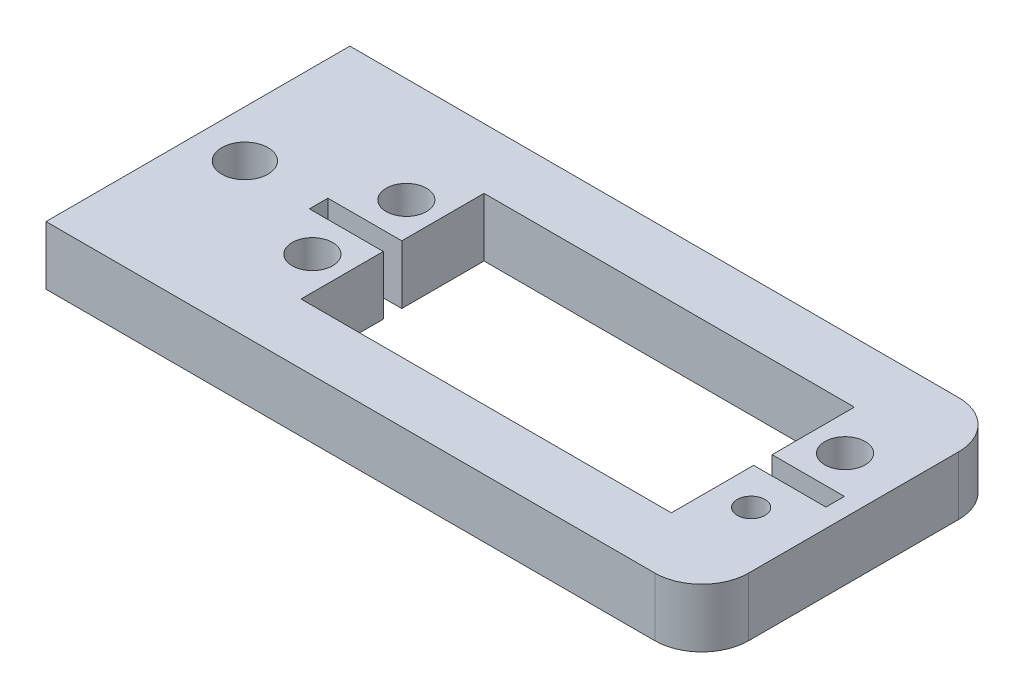
ISO-10303-21;
HEADER;
FILE_DESCRIPTION(('STEP AP214'),'2;1');
FILE_NAME('part.step','',(''),(''),'','','');
FILE_SCHEMA(('AUTOMOTIVE_DESIGN { 1 0 10303 214 1 1 1 1 }'));
ENDSEC;
DATA;
#1=APPLICATION_CONTEXT('core data for automotive mechanical design processes');
#2=APPLICATION_PROTOCOL_DEFINITION('international standard','automotive_design',2000,#1);
#3=PRODUCT_CONTEXT('',#1,'mechanical');
#4=PRODUCT('Part','Part','',(#3));
#5=PRODUCT_RELATED_PRODUCT_CATEGORY('part','',(#4));
#6=PRODUCT_DEFINITION_FORMATION('','',#4);
#7=PRODUCT_DEFINITION_CONTEXT('part definition',#1,'design');
#8=PRODUCT_DEFINITION('design','',#6,#7);
#9=PRODUCT_DEFINITION_SHAPE('','',#8);
#10=(LENGTH_UNIT() NAMED_UNIT(*) SI_UNIT(.MILLI.,.METRE.));
#11=(NAMED_UNIT(*) PLANE_ANGLE_UNIT() SI_UNIT($,.RADIAN.));
#12=(NAMED_UNIT(*) SI_UNIT($,.STERADIAN.) SOLID_ANGLE_UNIT());
#13=UNCERTAINTY_MEASURE_WITH_UNIT(LENGTH_MEASURE(1.E-05),#10,'distance_accuracy_value','');
#14=(GEOMETRIC_REPRESENTATION_CONTEXT(3) GLOBAL_UNCERTAINTY_ASSIGNED_CONTEXT((#13)) GLOBAL_UNIT_ASSIGNED_CONTEXT((#10,
#11,#12)) REPRESENTATION_CONTEXT('',''));
#15=CARTESIAN_POINT('',(0.,0.,0.));
#16=DIRECTION('',(0.,0.,1.));
#17=DIRECTION('',(1.,0.,0.));
#18=AXIS2_PLACEMENT_3D('',#15,#16,#17);
#19=CARTESIAN_POINT('',(-9.15301843580485,6.35,6.51192544293538));
#20=DIRECTION('',(0.,-1.,0.));
#21=DIRECTION('',(0.,0.,-1.));
#22=AXIS2_PLACEMENT_3D('',#19,#20,#21);
#23=PLANE('',#22);
#24=CARTESIAN_POINT('',(-10.0931709240917,6.35,12.7969254429202));
#25=DIRECTION('',(0.,1.,0.));
#26=DIRECTION('',(0.,0.,1.));
#27=AXIS2_PLACEMENT_3D('',#24,#25,#26);
#28=CIRCLE('',#27,2.19000000000024);
#29=CARTESIAN_POINT('',(-10.0931709240917,6.35,14.9869254429205));
#30=VERTEX_POINT('',#29);
#31=EDGE_CURVE('E340',#30,#30,#28,.T.);
#32=ORIENTED_EDGE('',*,*,#31,.F.);
#33=EDGE_LOOP('',(#32));
#34=FACE_BOUND('',#33,.T.);
#35=CARTESIAN_POINT('',(-69.9914430771704,6.35,17.8819254429201));
#36=DIRECTION('',(0.,1.,0.));
#37=DIRECTION('',(0.,0.,1.));
#38=AXIS2_PLACEMENT_3D('',#35,#36,#37);
#39=CIRCLE('',#38,2.50000000000016);
#40=CARTESIAN_POINT('',(-69.9914430771704,6.35,20.3819254429203));
#41=VERTEX_POINT('',#40);
#42=EDGE_CURVE('E352',#41,#41,#39,.T.);
#43=ORIENTED_EDGE('',*,*,#42,.F.);
#44=EDGE_LOOP('',(#43));
#45=FACE_BOUND('',#44,.T.);
#46=DIRECTION('',(0.,0.,-1.));
#47=VECTOR('',#46,1.);
#48=CARTESIAN_POINT('',(-6.0730184358051,6.35,16.8819254429171));
#49=LINE('',#48,#47);
#50=CARTESIAN_POINT('',(-6.0730184358051,6.35,18.8819254429171));
#51=VERTEX_POINT('',#50);
#52=CARTESIAN_POINT('',(-6.0730184358051,6.35,16.8819254429171));
#53=VERTEX_POINT('',#52);
#54=EDGE_CURVE('E158',#51,#53,#49,.T.);
#55=ORIENTED_EDGE('',*,*,#54,.F.);
#56=DIRECTION('',(1.,0.,0.));
#57=VECTOR('',#56,1.);
#58=CARTESIAN_POINT('',(-13.9031709240931,6.35,18.8819254429171));
#59=LINE('',#58,#57);
#60=CARTESIAN_POINT('',(-13.9031709240931,6.35,18.8819254429171));
#61=VERTEX_POINT('',#60);
#62=EDGE_CURVE('E201',#61,#51,#59,.T.);
#63=ORIENTED_EDGE('',*,*,#62,.F.);
#64=DIRECTION('',(0.,0.,-1.));
#65=VECTOR('',#64,1.);
#66=CARTESIAN_POINT('',(-13.9031709240931,6.35,18.8819254429171));
#67=LINE('',#66,#65);
#68=CARTESIAN_POINT('',(-13.9031709240931,6.35,27.7919254429201));
#69=VERTEX_POINT('',#68);
#70=EDGE_CURVE('E199',#69,#61,#67,.T.);
#71=ORIENTED_EDGE('',*,*,#70,.F.);
#72=DIRECTION('',(1.,0.,0.));
#73=VECTOR('',#72,1.);
#74=CARTESIAN_POINT('',(-13.9031709240931,6.35,27.7919254429201));
#75=LINE('',#74,#73);
#76=CARTESIAN_POINT('',(-54.0031709240929,6.35,27.7919254429201));
#77=VERTEX_POINT('',#76);
#78=EDGE_CURVE('E197',#77,#69,#75,.T.);
#79=ORIENTED_EDGE('',*,*,#78,.F.);
#80=DIRECTION('',(0.,0.,1.));
#81=VECTOR('',#80,1.);
#82=CARTESIAN_POINT('',(-54.0031709240929,6.35,27.7919254429201));
#83=LINE('',#82,#81);
#84=CARTESIAN_POINT('',(-54.0031709240929,6.35,18.8819254429171));
#85=VERTEX_POINT('',#84);
#86=EDGE_CURVE('E195',#85,#77,#83,.T.);
#87=ORIENTED_EDGE('',*,*,#86,.F.);
#88=DIRECTION('',(1.,0.,0.));
#89=VECTOR('',#88,1.);
#90=CARTESIAN_POINT('',(-62.0031709240925,6.35,18.8819254429171));
#91=LINE('',#90,#89);
#92=CARTESIAN_POINT('',(-62.0031709240925,6.35,18.8819254429171));
#93=VERTEX_POINT('',#92);
#94=EDGE_CURVE('E193',#93,#85,#91,.T.);
#95=ORIENTED_EDGE('',*,*,#94,.F.);
#96=DIRECTION('',(0.,0.,1.));
#97=VECTOR('',#96,1.);
#98=CARTESIAN_POINT('',(-62.0031709240925,6.35,16.8819254429171));
#99=LINE('',#98,#97);
#100=CARTESIAN_POINT('',(-62.0031709240925,6.35,16.8819254429171));
#101=VERTEX_POINT('',#100);
#102=EDGE_CURVE('E191',#101,#93,#99,.T.);
#103=ORIENTED_EDGE('',*,*,#102,.F.);
#104=DIRECTION('',(-1.,0.,0.));
#105=VECTOR('',#104,1.);
#106=CARTESIAN_POINT('',(-54.0031709240929,6.35,16.8819254429171));
#107=LINE('',#106,#105);
#108=CARTESIAN_POINT('',(-54.0031709240929,6.35,16.8819254429171));
#109=VERTEX_POINT('',#108);
#110=EDGE_CURVE('E189',#109,#101,#107,.T.);
#111=ORIENTED_EDGE('',*,*,#110,.F.);
#112=DIRECTION('',(0.,0.,1.));
#113=VECTOR('',#112,1.);
#114=CARTESIAN_POINT('',(-54.0031709240929,6.35,16.8819254429171));
#115=LINE('',#114,#113);
#116=CARTESIAN_POINT('',(-54.0031709240929,6.35,7.97192544291991));
#117=VERTEX_POINT('',#116);
#118=EDGE_CURVE('E187',#117,#109,#115,.T.);
#119=ORIENTED_EDGE('',*,*,#118,.F.);
#120=DIRECTION('',(-1.,0.,0.));
#121=VECTOR('',#120,1.);
#122=CARTESIAN_POINT('',(-54.0031709240929,6.35,7.97192544291991));
#123=LINE('',#122,#121);
#124=CARTESIAN_POINT('',(-13.9031709240931,6.35,7.97192544291991));
#125=VERTEX_POINT('',#124);
#126=EDGE_CURVE('E182',#125,#117,#123,.T.);
#127=ORIENTED_EDGE('',*,*,#126,.F.);
#128=DIRECTION('',(0.,0.,-1.));
#129=VECTOR('',#128,1.);
#130=CARTESIAN_POINT('',(-13.9031709240931,6.35,7.97192544291991));
#131=LINE('',#130,#129);
#132=CARTESIAN_POINT('',(-13.9031709240931,6.35,16.8819254429171));
#133=VERTEX_POINT('',#132);
#134=EDGE_CURVE('E180',#133,#125,#131,.T.);
#135=ORIENTED_EDGE('',*,*,#134,.F.);
#136=DIRECTION('',(-1.,0.,0.));
#137=VECTOR('',#136,1.);
#138=CARTESIAN_POINT('',(-13.9031709240931,6.35,16.8819254429171));
#139=LINE('',#138,#137);
#140=EDGE_CURVE('E166',#53,#133,#139,.T.);
#141=ORIENTED_EDGE('',*,*,#140,.F.);
#142=EDGE_LOOP('',(#55,#63,#71,#79,#87,#95,#103,#111,#119,#127,#135,#141));
#143=FACE_BOUND('',#142,.T.);
#144=DIRECTION('',(-1.,0.,0.));
#145=VECTOR('',#144,1.);
#146=CARTESIAN_POINT('',(-75.0730184358046,6.35,1.43192544293586));
#147=LINE('',#146,#145);
#148=CARTESIAN_POINT('',(-9.15301843580485,6.35,1.43192544293586));
#149=VERTEX_POINT('',#148);
#150=CARTESIAN_POINT('',(-75.0730184358046,6.35,1.43192544293586));
#151=VERTEX_POINT('',#150);
#152=EDGE_CURVE('E254',#149,#151,#147,.T.);
#153=ORIENTED_EDGE('',*,*,#152,.T.);
#154=DIRECTION('',(0.,0.,1.));
#155=VECTOR('',#154,1.);
#156=CARTESIAN_POINT('',(-75.0730184358046,6.35,6.51192544291973));
#157=LINE('',#156,#155);
#158=CARTESIAN_POINT('',(-75.0730184358046,6.35,34.3319254429354));
#159=VERTEX_POINT('',#158);
#160=EDGE_CURVE('E257',#151,#159,#157,.T.);
#161=ORIENTED_EDGE('',*,*,#160,.T.);
#162=DIRECTION('',(1.,0.,0.));
#163=VECTOR('',#162,1.);
#164=CARTESIAN_POINT('',(-75.0730184358046,6.35,34.3319254429354));
#165=LINE('',#164,#163);
#166=CARTESIAN_POINT('',(-9.15301843580485,6.35,34.3319254429353));
#167=VERTEX_POINT('',#166);
#168=EDGE_CURVE('E260',#159,#167,#165,.T.);
#169=ORIENTED_EDGE('',*,*,#168,.T.);
#170=CARTESIAN_POINT('',(-9.15301843580485,6.35,29.2519254429358));
#171=DIRECTION('',(0.,1.,0.));
#172=DIRECTION('',(0.,0.,-1.));
#173=AXIS2_PLACEMENT_3D('',#170,#171,#172);
#174=CIRCLE('',#173,5.07999999999953);
#175=CARTESIAN_POINT('',(-4.07301843580532,6.35,29.2519254429244));
#176=VERTEX_POINT('',#175);
#177=EDGE_CURVE('E262',#167,#176,#174,.T.);
#178=ORIENTED_EDGE('',*,*,#177,.T.);
#179=DIRECTION('',(0.,0.,-1.));
#180=VECTOR('',#179,1.);
#181=CARTESIAN_POINT('',(-4.07301843580532,6.35,6.51192544291973));
#182=LINE('',#181,#180);
#183=CARTESIAN_POINT('',(-4.07301843580532,6.35,6.51192544291973));
#184=VERTEX_POINT('',#183);
#185=EDGE_CURVE('E264',#176,#184,#182,.T.);
#186=ORIENTED_EDGE('',*,*,#185,.T.);
#187=CARTESIAN_POINT('',(-9.15301843580485,6.35,6.51192544293538));
#188=DIRECTION('',(0.,1.,0.));
#189=DIRECTION('',(0.,0.,-1.));
#190=AXIS2_PLACEMENT_3D('',#187,#188,#189);
#191=CIRCLE('',#190,5.07999999999953);
#192=EDGE_CURVE('E266',#184,#149,#191,.T.);
#193=ORIENTED_EDGE('',*,*,#192,.T.);
#194=EDGE_LOOP('',(#153,#161,#169,#178,#186,#193));
#195=FACE_BOUND('',#194,.T.);
#196=CARTESIAN_POINT('',(-57.5931709240942,6.35,22.9669254429198));
#197=DIRECTION('',(0.,1.,0.));
#198=DIRECTION('',(0.,0.,1.));
#199=AXIS2_PLACEMENT_3D('',#196,#197,#198);
#200=CIRCLE('',#199,2.19000000000027);
#201=CARTESIAN_POINT('',(-57.5931709240942,6.35,25.1569254429201));
#202=VERTEX_POINT('',#201);
#203=EDGE_CURVE('E204',#202,#202,#200,.T.);
#204=ORIENTED_EDGE('',*,*,#203,.F.);
#205=EDGE_LOOP('',(#204));
#206=FACE_BOUND('',#205,.T.);
#207=CARTESIAN_POINT('',(-57.5931709240942,6.35,12.7969254429202));
#208=DIRECTION('',(0.,1.,0.));
#209=DIRECTION('',(0.,0.,-1.));
#210=AXIS2_PLACEMENT_3D('',#207,#208,#209);
#211=CIRCLE('',#210,2.19000000000027);
#212=CARTESIAN_POINT('',(-57.5931709240942,6.35,10.6069254429199));
#213=VERTEX_POINT('',#212);
#214=EDGE_CURVE('E331',#213,#213,#211,.T.);
#215=ORIENTED_EDGE('',*,*,#214,.F.);
#216=EDGE_LOOP('',(#215));
#217=FACE_BOUND('',#216,.T.);
#218=CARTESIAN_POINT('',(-10.0931709240917,6.35,22.9669254429198));
#219=DIRECTION('',(0.,1.,0.));
#220=DIRECTION('',(0.,0.,-1.));
#221=AXIS2_PLACEMENT_3D('',#218,#219,#220);
#222=CIRCLE('',#221,1.50000000000008);
#223=CARTESIAN_POINT('',(-10.0931709240917,6.35,21.4669254429197));
#224=VERTEX_POINT('',#223);
#225=EDGE_CURVE('E334',#224,#224,#222,.T.);
#226=ORIENTED_EDGE('',*,*,#225,.F.);
#227=EDGE_LOOP('',(#226));
#228=FACE_BOUND('',#227,.T.);
#229=ADVANCED_FACE('F33',(#34,#45,#143,#195,#206,#217,#228),#23,.F.);
#230=CARTESIAN_POINT('',(-9.15301843580485,0.,6.51192544293538));
#231=DIRECTION('',(0.,-1.,0.));
#232=DIRECTION('',(0.,0.,-1.));
#233=AXIS2_PLACEMENT_3D('',#230,#231,#232);
#234=PLANE('',#233);
#235=CARTESIAN_POINT('',(-10.0931709240917,0.,12.7969254429202));
#236=DIRECTION('',(0.,1.,0.));
#237=DIRECTION('',(0.,0.,1.));
#238=AXIS2_PLACEMENT_3D('',#235,#236,#237);
#239=CIRCLE('',#238,2.19000000000024);
#240=CARTESIAN_POINT('',(-10.0931709240917,0.,14.9869254429205));
#241=VERTEX_POINT('',#240);
#242=EDGE_CURVE('E336',#241,#241,#239,.T.);
#243=ORIENTED_EDGE('',*,*,#242,.T.);
#244=EDGE_LOOP('',(#243));
#245=FACE_BOUND('',#244,.T.);
#246=CARTESIAN_POINT('',(-69.9914430771704,0.,17.8819254429201));
#247=DIRECTION('',(0.,1.,0.));
#248=DIRECTION('',(0.,0.,1.));
#249=AXIS2_PLACEMENT_3D('',#246,#247,#248);
#250=CIRCLE('',#249,2.50000000000016);
#251=CARTESIAN_POINT('',(-69.9914430771704,0.,20.3819254429203));
#252=VERTEX_POINT('',#251);
#253=EDGE_CURVE('E349',#252,#252,#250,.T.);
#254=ORIENTED_EDGE('',*,*,#253,.T.);
#255=EDGE_LOOP('',(#254));
#256=FACE_BOUND('',#255,.T.);
#257=DIRECTION('',(1.,0.,0.));
#258=VECTOR('',#257,1.);
#259=CARTESIAN_POINT('',(-13.9031709240931,0.,18.8819254429171));
#260=LINE('',#259,#258);
#261=CARTESIAN_POINT('',(-13.9031709240931,0.,18.8819254429171));
#262=VERTEX_POINT('',#261);
#263=CARTESIAN_POINT('',(-6.0730184358051,0.,18.8819254429171));
#264=VERTEX_POINT('',#263);
#265=EDGE_CURVE('E167',#262,#264,#260,.T.);
#266=ORIENTED_EDGE('',*,*,#265,.T.);
#267=DIRECTION('',(0.,0.,-1.));
#268=VECTOR('',#267,1.);
#269=CARTESIAN_POINT('',(-6.0730184358051,0.,16.8819254429171));
#270=LINE('',#269,#268);
#271=CARTESIAN_POINT('',(-6.0730184358051,0.,16.8819254429171));
#272=VERTEX_POINT('',#271);
#273=EDGE_CURVE('E56',#264,#272,#270,.T.);
#274=ORIENTED_EDGE('',*,*,#273,.T.);
#275=DIRECTION('',(-1.,0.,0.));
#276=VECTOR('',#275,1.);
#277=CARTESIAN_POINT('',(-13.9031709240931,0.,16.8819254429171));
#278=LINE('',#277,#276);
#279=CARTESIAN_POINT('',(-13.9031709240931,0.,16.8819254429171));
#280=VERTEX_POINT('',#279);
#281=EDGE_CURVE('E173',#272,#280,#278,.T.);
#282=ORIENTED_EDGE('',*,*,#281,.T.);
#283=DIRECTION('',(0.,0.,-1.));
#284=VECTOR('',#283,1.);
#285=CARTESIAN_POINT('',(-13.9031709240931,0.,7.97192544291991));
#286=LINE('',#285,#284);
#287=CARTESIAN_POINT('',(-13.9031709240931,0.,7.97192544291991));
#288=VERTEX_POINT('',#287);
#289=EDGE_CURVE('E206',#280,#288,#286,.T.);
#290=ORIENTED_EDGE('',*,*,#289,.T.);
#291=DIRECTION('',(-1.,0.,0.));
#292=VECTOR('',#291,1.);
#293=CARTESIAN_POINT('',(-54.0031709240929,0.,7.97192544291991));
#294=LINE('',#293,#292);
#295=CARTESIAN_POINT('',(-54.0031709240929,0.,7.97192544291991));
#296=VERTEX_POINT('',#295);
#297=EDGE_CURVE('E209',#288,#296,#294,.T.);
#298=ORIENTED_EDGE('',*,*,#297,.T.);
#299=DIRECTION('',(0.,0.,1.));
#300=VECTOR('',#299,1.);
#301=CARTESIAN_POINT('',(-54.0031709240929,0.,16.8819254429171));
#302=LINE('',#301,#300);
#303=CARTESIAN_POINT('',(-54.0031709240929,0.,16.8819254429171));
#304=VERTEX_POINT('',#303);
#305=EDGE_CURVE('E212',#296,#304,#302,.T.);
#306=ORIENTED_EDGE('',*,*,#305,.T.);
#307=DIRECTION('',(-1.,0.,0.));
#308=VECTOR('',#307,1.);
#309=CARTESIAN_POINT('',(-54.0031709240929,0.,16.8819254429171));
#310=LINE('',#309,#308);
#311=CARTESIAN_POINT('',(-62.0031709240925,0.,16.8819254429171));
#312=VERTEX_POINT('',#311);
#313=EDGE_CURVE('E215',#304,#312,#310,.T.);
#314=ORIENTED_EDGE('',*,*,#313,.T.);
#315=DIRECTION('',(0.,0.,1.));
#316=VECTOR('',#315,1.);
#317=CARTESIAN_POINT('',(-62.0031709240925,0.,16.8819254429171));
#318=LINE('',#317,#316);
#319=CARTESIAN_POINT('',(-62.0031709240925,0.,18.8819254429171));
#320=VERTEX_POINT('',#319);
#321=EDGE_CURVE('E218',#312,#320,#318,.T.);
#322=ORIENTED_EDGE('',*,*,#321,.T.);
#323=DIRECTION('',(1.,0.,0.));
#324=VECTOR('',#323,1.);
#325=CARTESIAN_POINT('',(-62.0031709240925,0.,18.8819254429171));
#326=LINE('',#325,#324);
#327=CARTESIAN_POINT('',(-54.0031709240929,0.,18.8819254429171));
#328=VERTEX_POINT('',#327);
#329=EDGE_CURVE('E221',#320,#328,#326,.T.);
#330=ORIENTED_EDGE('',*,*,#329,.T.);
#331=DIRECTION('',(0.,0.,1.));
#332=VECTOR('',#331,1.);
#333=CARTESIAN_POINT('',(-54.0031709240929,0.,27.7919254429201));
#334=LINE('',#333,#332);
#335=CARTESIAN_POINT('',(-54.0031709240929,0.,27.7919254429201));
#336=VERTEX_POINT('',#335);
#337=EDGE_CURVE('E224',#328,#336,#334,.T.);
#338=ORIENTED_EDGE('',*,*,#337,.T.);
#339=DIRECTION('',(1.,0.,0.));
#340=VECTOR('',#339,1.);
#341=CARTESIAN_POINT('',(-13.9031709240931,0.,27.7919254429201));
#342=LINE('',#341,#340);
#343=CARTESIAN_POINT('',(-13.9031709240931,0.,27.7919254429201));
#344=VERTEX_POINT('',#343);
#345=EDGE_CURVE('E227',#336,#344,#342,.T.);
#346=ORIENTED_EDGE('',*,*,#345,.T.);
#347=DIRECTION('',(0.,0.,-1.));
#348=VECTOR('',#347,1.);
#349=CARTESIAN_POINT('',(-13.9031709240931,0.,18.8819254429171));
#350=LINE('',#349,#348);
#351=EDGE_CURVE('E230',#344,#262,#350,.T.);
#352=ORIENTED_EDGE('',*,*,#351,.T.);
#353=EDGE_LOOP('',(#266,#274,#282,#290,#298,#306,#314,#322,#330,#338,#346,#352));
#354=FACE_BOUND('',#353,.T.);
#355=DIRECTION('',(0.,0.,1.));
#356=VECTOR('',#355,1.);
#357=CARTESIAN_POINT('',(-75.0730184358046,0.,29.2519254429244));
#358=LINE('',#357,#356);
#359=CARTESIAN_POINT('',(-75.0730184358046,0.,1.43192544293586));
#360=VERTEX_POINT('',#359);
#361=CARTESIAN_POINT('',(-75.0730184358046,0.,34.3319254429354));
#362=VERTEX_POINT('',#361);
#363=EDGE_CURVE('E174',#360,#362,#358,.T.);
#364=ORIENTED_EDGE('',*,*,#363,.F.);
#365=DIRECTION('',(-1.,0.,0.));
#366=VECTOR('',#365,1.);
#367=CARTESIAN_POINT('',(-9.15301843580485,0.,1.43192544293586));
#368=LINE('',#367,#366);
#369=CARTESIAN_POINT('',(-9.15301843580485,0.,1.43192544293586));
#370=VERTEX_POINT('',#369);
#371=EDGE_CURVE('E258',#370,#360,#368,.T.);
#372=ORIENTED_EDGE('',*,*,#371,.F.);
#373=CARTESIAN_POINT('',(-9.15301843580485,0.,6.51192544293538));
#374=DIRECTION('',(0.,1.,0.));
#375=DIRECTION('',(0.,0.,-1.));
#376=AXIS2_PLACEMENT_3D('',#373,#374,#375);
#377=CIRCLE('',#376,5.07999999999953);
#378=CARTESIAN_POINT('',(-4.07301843580532,0.,6.51192544291973));
#379=VERTEX_POINT('',#378);
#380=EDGE_CURVE('E278',#379,#370,#377,.T.);
#381=ORIENTED_EDGE('',*,*,#380,.F.);
#382=DIRECTION('',(0.,0.,-1.));
#383=VECTOR('',#382,1.);
#384=CARTESIAN_POINT('',(-4.07301843580532,0.,6.51192544291973));
#385=LINE('',#384,#383);
#386=CARTESIAN_POINT('',(-4.07301843580532,0.,29.2519254429244));
#387=VERTEX_POINT('',#386);
#388=EDGE_CURVE('E276',#387,#379,#385,.T.);
#389=ORIENTED_EDGE('',*,*,#388,.F.);
#390=CARTESIAN_POINT('',(-9.15301843580485,0.,29.2519254429358));
#391=DIRECTION('',(0.,1.,0.));
#392=DIRECTION('',(0.,0.,-1.));
#393=AXIS2_PLACEMENT_3D('',#390,#391,#392);
#394=CIRCLE('',#393,5.07999999999953);
#395=CARTESIAN_POINT('',(-9.15301843580485,0.,34.3319254429353));
#396=VERTEX_POINT('',#395);
#397=EDGE_CURVE('E274',#396,#387,#394,.T.);
#398=ORIENTED_EDGE('',*,*,#397,.F.);
#399=DIRECTION('',(1.,0.,0.));
#400=VECTOR('',#399,1.);
#401=CARTESIAN_POINT('',(-9.15301843580485,0.,34.3319254429353));
#402=LINE('',#401,#400);
#403=EDGE_CURVE('E272',#362,#396,#402,.T.);
#404=ORIENTED_EDGE('',*,*,#403,.F.);
#405=EDGE_LOOP('',(#364,#372,#381,#389,#398,#404));
#406=FACE_BOUND('',#405,.T.);
#407=CARTESIAN_POINT('',(-57.5931709240942,0.,22.9669254429198));
#408=DIRECTION('',(0.,1.,0.));
#409=DIRECTION('',(0.,0.,1.));
#410=AXIS2_PLACEMENT_3D('',#407,#408,#409);
#411=CIRCLE('',#410,2.19000000000027);
#412=CARTESIAN_POINT('',(-57.5931709240942,0.,25.1569254429201));
#413=VERTEX_POINT('',#412);
#414=EDGE_CURVE('E355',#413,#413,#411,.T.);
#415=ORIENTED_EDGE('',*,*,#414,.T.);
#416=EDGE_LOOP('',(#415));
#417=FACE_BOUND('',#416,.T.);
#418=CARTESIAN_POINT('',(-57.5931709240942,0.,12.7969254429202));
#419=DIRECTION('',(0.,1.,0.));
#420=DIRECTION('',(0.,0.,-1.));
#421=AXIS2_PLACEMENT_3D('',#418,#419,#420);
#422=CIRCLE('',#421,2.19000000000027);
#423=CARTESIAN_POINT('',(-57.5931709240942,0.,10.6069254429199));
#424=VERTEX_POINT('',#423);
#425=EDGE_CURVE('E346',#424,#424,#422,.T.);
#426=ORIENTED_EDGE('',*,*,#425,.T.);
#427=EDGE_LOOP('',(#426));
#428=FACE_BOUND('',#427,.T.);
#429=CARTESIAN_POINT('',(-10.0931709240917,0.,22.9669254429198));
#430=DIRECTION('',(0.,1.,0.));
#431=DIRECTION('',(0.,0.,-1.));
#432=AXIS2_PLACEMENT_3D('',#429,#430,#431);
#433=CIRCLE('',#432,1.50000000000008);
#434=CARTESIAN_POINT('',(-10.0931709240917,0.,21.4669254429197));
#435=VERTEX_POINT('',#434);
#436=EDGE_CURVE('E337',#435,#435,#433,.T.);
#437=ORIENTED_EDGE('',*,*,#436,.T.);
#438=EDGE_LOOP('',(#437));
#439=FACE_BOUND('',#438,.T.);
#440=ADVANCED_FACE('F302',(#245,#256,#354,#406,#417,#428,#439),#234,.T.);
#441=CARTESIAN_POINT('',(-75.0730184358046,6.35,29.2519254429244));
#442=DIRECTION('',(1.,0.,0.));
#443=DIRECTION('',(0.,0.,-1.));
#444=AXIS2_PLACEMENT_3D('',#441,#442,#443);
#445=PLANE('',#444);
#446=ORIENTED_EDGE('',*,*,#363,.T.);
#447=DIRECTION('',(0.,-1.,0.));
#448=VECTOR('',#447,1.);
#449=CARTESIAN_POINT('',(-75.0730184358046,6.35,34.3319254429354));
#450=LINE('',#449,#448);
#451=EDGE_CURVE('E41',#159,#362,#450,.T.);
#452=ORIENTED_EDGE('',*,*,#451,.F.);
#453=ORIENTED_EDGE('',*,*,#160,.F.);
#454=DIRECTION('',(0.,-1.,0.));
#455=VECTOR('',#454,1.);
#456=CARTESIAN_POINT('',(-75.0730184358046,6.35,1.43192544293586));
#457=LINE('',#456,#455);
#458=EDGE_CURVE('E11',#151,#360,#457,.T.);
#459=ORIENTED_EDGE('',*,*,#458,.T.);
#460=EDGE_LOOP('',(#446,#452,#453,#459));
#461=FACE_BOUND('',#460,.T.);
#462=ADVANCED_FACE('F35',(#461),#445,.F.);
#463=CARTESIAN_POINT('',(-9.15301843580485,6.35,34.3319254429353));
#464=DIRECTION('',(0.,0.,-1.));
#465=DIRECTION('',(-1.,0.,0.));
#466=AXIS2_PLACEMENT_3D('',#463,#464,#465);
#467=PLANE('',#466);
#468=ORIENTED_EDGE('',*,*,#403,.T.);
#469=DIRECTION('',(0.,-1.,0.));
#470=VECTOR('',#469,1.);
#471=CARTESIAN_POINT('',(-9.15301843580485,6.35,34.3319254429353));
#472=LINE('',#471,#470);
#473=EDGE_CURVE('E290',#167,#396,#472,.T.);
#474=ORIENTED_EDGE('',*,*,#473,.F.);
#475=ORIENTED_EDGE('',*,*,#168,.F.);
#476=ORIENTED_EDGE('',*,*,#451,.T.);
#477=EDGE_LOOP('',(#468,#474,#475,#476));
#478=FACE_BOUND('',#477,.T.);
#479=ADVANCED_FACE('F296',(#478),#467,.F.);
#480=CARTESIAN_POINT('',(-9.15301843580485,6.35,29.2519254429358));
#481=DIRECTION('',(0.,-1.,0.));
#482=DIRECTION('',(0.,0.,-1.));
#483=AXIS2_PLACEMENT_3D('',#480,#481,#482);
#484=CYLINDRICAL_SURFACE('',#483,5.07999999999953);
#485=ORIENTED_EDGE('',*,*,#397,.T.);
#486=DIRECTION('',(0.,-1.,0.));
#487=VECTOR('',#486,1.);
#488=CARTESIAN_POINT('',(-4.07301843580532,6.35,29.2519254429244));
#489=LINE('',#488,#487);
#490=EDGE_CURVE('E287',#176,#387,#489,.T.);
#491=ORIENTED_EDGE('',*,*,#490,.F.);
#492=ORIENTED_EDGE('',*,*,#177,.F.);
#493=ORIENTED_EDGE('',*,*,#473,.T.);
#494=EDGE_LOOP('',(#485,#491,#492,#493));
#495=FACE_BOUND('',#494,.T.);
#496=ADVANCED_FACE('F320',(#495),#484,.T.);
#497=CARTESIAN_POINT('',(-4.07301843580532,6.35,6.51192544291973));
#498=DIRECTION('',(-1.,0.,0.));
#499=DIRECTION('',(0.,0.,1.));
#500=AXIS2_PLACEMENT_3D('',#497,#498,#499);
#501=PLANE('',#500);
#502=ORIENTED_EDGE('',*,*,#388,.T.);
#503=DIRECTION('',(0.,-1.,0.));
#504=VECTOR('',#503,1.);
#505=CARTESIAN_POINT('',(-4.07301843580532,6.35,6.51192544291973));
#506=LINE('',#505,#504);
#507=EDGE_CURVE('E284',#184,#379,#506,.T.);
#508=ORIENTED_EDGE('',*,*,#507,.F.);
#509=ORIENTED_EDGE('',*,*,#185,.F.);
#510=ORIENTED_EDGE('',*,*,#490,.T.);
#511=EDGE_LOOP('',(#502,#508,#509,#510));
#512=FACE_BOUND('',#511,.T.);
#513=ADVANCED_FACE('F315',(#512),#501,.F.);
#514=CARTESIAN_POINT('',(-9.15301843580485,6.35,6.51192544293538));
#515=DIRECTION('',(0.,-1.,0.));
#516=DIRECTION('',(0.,0.,-1.));
#517=AXIS2_PLACEMENT_3D('',#514,#515,#516);
#518=CYLINDRICAL_SURFACE('',#517,5.07999999999953);
#519=ORIENTED_EDGE('',*,*,#380,.T.);
#520=DIRECTION('',(0.,-1.,0.));
#521=VECTOR('',#520,1.);
#522=CARTESIAN_POINT('',(-9.15301843580485,6.35,1.43192544293586));
#523=LINE('',#522,#521);
#524=EDGE_CURVE('E269',#149,#370,#523,.T.);
#525=ORIENTED_EDGE('',*,*,#524,.F.);
#526=ORIENTED_EDGE('',*,*,#192,.F.);
#527=ORIENTED_EDGE('',*,*,#507,.T.);
#528=EDGE_LOOP('',(#519,#525,#526,#527));
#529=FACE_BOUND('',#528,.T.);
#530=ADVANCED_FACE('F311',(#529),#518,.T.);
#531=CARTESIAN_POINT('',(-9.15301843580485,6.35,1.43192544293586));
#532=DIRECTION('',(0.,0.,1.));
#533=DIRECTION('',(1.,0.,0.));
#534=AXIS2_PLACEMENT_3D('',#531,#532,#533);
#535=PLANE('',#534);
#536=ORIENTED_EDGE('',*,*,#371,.T.);
#537=ORIENTED_EDGE('',*,*,#458,.F.);
#538=ORIENTED_EDGE('',*,*,#152,.F.);
#539=ORIENTED_EDGE('',*,*,#524,.T.);
#540=EDGE_LOOP('',(#536,#537,#538,#539));
#541=FACE_BOUND('',#540,.T.);
#542=ADVANCED_FACE('F307',(#541),#535,.F.);
#543=CARTESIAN_POINT('',(-6.0730184358051,6.35,16.8819254429171));
#544=DIRECTION('',(-1.,0.,0.));
#545=DIRECTION('',(0.,0.,1.));
#546=AXIS2_PLACEMENT_3D('',#543,#544,#545);
#547=PLANE('',#546);
#548=ORIENTED_EDGE('',*,*,#273,.F.);
#549=DIRECTION('',(0.,-1.,0.));
#550=VECTOR('',#549,1.);
#551=CARTESIAN_POINT('',(-6.0730184358051,6.35,18.8819254429171));
#552=LINE('',#551,#550);
#553=EDGE_CURVE('E162',#51,#264,#552,.T.);
#554=ORIENTED_EDGE('',*,*,#553,.F.);
#555=ORIENTED_EDGE('',*,*,#54,.T.);
#556=DIRECTION('',(0.,-1.,0.));
#557=VECTOR('',#556,1.);
#558=CARTESIAN_POINT('',(-6.0730184358051,6.35,16.8819254429171));
#559=LINE('',#558,#557);
#560=EDGE_CURVE('E161',#53,#272,#559,.T.);
#561=ORIENTED_EDGE('',*,*,#560,.T.);
#562=EDGE_LOOP('',(#548,#554,#555,#561));
#563=FACE_BOUND('',#562,.T.);
#564=ADVANCED_FACE('F160',(#563),#547,.T.);
#565=CARTESIAN_POINT('',(-13.9031709240931,6.35,16.8819254429171));
#566=DIRECTION('',(0.,0.,1.));
#567=DIRECTION('',(1.,0.,0.));
#568=AXIS2_PLACEMENT_3D('',#565,#566,#567);
#569=PLANE('',#568);
#570=ORIENTED_EDGE('',*,*,#281,.F.);
#571=ORIENTED_EDGE('',*,*,#560,.F.);
#572=ORIENTED_EDGE('',*,*,#140,.T.);
#573=DIRECTION('',(0.,-1.,0.));
#574=VECTOR('',#573,1.);
#575=CARTESIAN_POINT('',(-13.9031709240931,6.35,16.8819254429171));
#576=LINE('',#575,#574);
#577=EDGE_CURVE('E175',#133,#280,#576,.T.);
#578=ORIENTED_EDGE('',*,*,#577,.T.);
#579=EDGE_LOOP('',(#570,#571,#572,#578));
#580=FACE_BOUND('',#579,.T.);
#581=ADVANCED_FACE('F170',(#580),#569,.T.);
#582=CARTESIAN_POINT('',(-13.9031709240931,6.35,7.97192544291991));
#583=DIRECTION('',(-1.,0.,0.));
#584=DIRECTION('',(0.,0.,1.));
#585=AXIS2_PLACEMENT_3D('',#582,#583,#584);
#586=PLANE('',#585);
#587=ORIENTED_EDGE('',*,*,#289,.F.);
#588=ORIENTED_EDGE('',*,*,#577,.F.);
#589=ORIENTED_EDGE('',*,*,#134,.T.);
#590=DIRECTION('',(0.,-1.,0.));
#591=VECTOR('',#590,1.);
#592=CARTESIAN_POINT('',(-13.9031709240931,6.35,7.97192544291991));
#593=LINE('',#592,#591);
#594=EDGE_CURVE('E251',#125,#288,#593,.T.);
#595=ORIENTED_EDGE('',*,*,#594,.T.);
#596=EDGE_LOOP('',(#587,#588,#589,#595));
#597=FACE_BOUND('',#596,.T.);
#598=ADVANCED_FACE('F409',(#597),#586,.T.);
#599=CARTESIAN_POINT('',(-54.0031709240929,6.35,7.97192544291991));
#600=DIRECTION('',(0.,0.,1.));
#601=DIRECTION('',(1.,0.,0.));
#602=AXIS2_PLACEMENT_3D('',#599,#600,#601);
#603=PLANE('',#602);
#604=ORIENTED_EDGE('',*,*,#297,.F.);
#605=ORIENTED_EDGE('',*,*,#594,.F.);
#606=ORIENTED_EDGE('',*,*,#126,.T.);
#607=DIRECTION('',(0.,-1.,0.));
#608=VECTOR('',#607,1.);
#609=CARTESIAN_POINT('',(-54.0031709240929,6.35,7.97192544291991));
#610=LINE('',#609,#608);
#611=EDGE_CURVE('E249',#117,#296,#610,.T.);
#612=ORIENTED_EDGE('',*,*,#611,.T.);
#613=EDGE_LOOP('',(#604,#605,#606,#612));
#614=FACE_BOUND('',#613,.T.);
#615=ADVANCED_FACE('F405',(#614),#603,.T.);
#616=CARTESIAN_POINT('',(-54.0031709240929,6.35,16.8819254429171));
#617=DIRECTION('',(1.,0.,0.));
#618=DIRECTION('',(0.,0.,-1.));
#619=AXIS2_PLACEMENT_3D('',#616,#617,#618);
#620=PLANE('',#619);
#621=ORIENTED_EDGE('',*,*,#305,.F.);
#622=ORIENTED_EDGE('',*,*,#611,.F.);
#623=ORIENTED_EDGE('',*,*,#118,.T.);
#624=DIRECTION('',(0.,-1.,0.));
#625=VECTOR('',#624,1.);
#626=CARTESIAN_POINT('',(-54.0031709240929,6.35,16.8819254429171));
#627=LINE('',#626,#625);
#628=EDGE_CURVE('E247',#109,#304,#627,.T.);
#629=ORIENTED_EDGE('',*,*,#628,.T.);
#630=EDGE_LOOP('',(#621,#622,#623,#629));
#631=FACE_BOUND('',#630,.T.);
#632=ADVANCED_FACE('F401',(#631),#620,.T.);
#633=CARTESIAN_POINT('',(-54.0031709240929,6.35,16.8819254429171));
#634=DIRECTION('',(0.,0.,1.));
#635=DIRECTION('',(1.,0.,0.));
#636=AXIS2_PLACEMENT_3D('',#633,#634,#635);
#637=PLANE('',#636);
#638=ORIENTED_EDGE('',*,*,#313,.F.);
#639=ORIENTED_EDGE('',*,*,#628,.F.);
#640=ORIENTED_EDGE('',*,*,#110,.T.);
#641=DIRECTION('',(0.,-1.,0.));
#642=VECTOR('',#641,1.);
#643=CARTESIAN_POINT('',(-62.0031709240925,6.35,16.8819254429171));
#644=LINE('',#643,#642);
#645=EDGE_CURVE('E245',#101,#312,#644,.T.);
#646=ORIENTED_EDGE('',*,*,#645,.T.);
#647=EDGE_LOOP('',(#638,#639,#640,#646));
#648=FACE_BOUND('',#647,.T.);
#649=ADVANCED_FACE('F397',(#648),#637,.T.);
#650=CARTESIAN_POINT('',(-62.0031709240925,6.35,16.8819254429171));
#651=DIRECTION('',(1.,0.,0.));
#652=DIRECTION('',(0.,0.,-1.));
#653=AXIS2_PLACEMENT_3D('',#650,#651,#652);
#654=PLANE('',#653);
#655=ORIENTED_EDGE('',*,*,#321,.F.);
#656=ORIENTED_EDGE('',*,*,#645,.F.);
#657=ORIENTED_EDGE('',*,*,#102,.T.);
#658=DIRECTION('',(0.,-1.,0.));
#659=VECTOR('',#658,1.);
#660=CARTESIAN_POINT('',(-62.0031709240925,6.35,18.8819254429171));
#661=LINE('',#660,#659);
#662=EDGE_CURVE('E243',#93,#320,#661,.T.);
#663=ORIENTED_EDGE('',*,*,#662,.T.);
#664=EDGE_LOOP('',(#655,#656,#657,#663));
#665=FACE_BOUND('',#664,.T.);
#666=ADVANCED_FACE('F393',(#665),#654,.T.);
#667=CARTESIAN_POINT('',(-62.0031709240925,6.35,18.8819254429171));
#668=DIRECTION('',(0.,0.,-1.));
#669=DIRECTION('',(-1.,0.,0.));
#670=AXIS2_PLACEMENT_3D('',#667,#668,#669);
#671=PLANE('',#670);
#672=ORIENTED_EDGE('',*,*,#329,.F.);
#673=ORIENTED_EDGE('',*,*,#662,.F.);
#674=ORIENTED_EDGE('',*,*,#94,.T.);
#675=DIRECTION('',(0.,-1.,0.));
#676=VECTOR('',#675,1.);
#677=CARTESIAN_POINT('',(-54.0031709240929,6.35,18.8819254429171));
#678=LINE('',#677,#676);
#679=EDGE_CURVE('E241',#85,#328,#678,.T.);
#680=ORIENTED_EDGE('',*,*,#679,.T.);
#681=EDGE_LOOP('',(#672,#673,#674,#680));
#682=FACE_BOUND('',#681,.T.);
#683=ADVANCED_FACE('F389',(#682),#671,.T.);
#684=CARTESIAN_POINT('',(-54.0031709240929,6.35,27.7919254429201));
#685=DIRECTION('',(1.,0.,0.));
#686=DIRECTION('',(0.,0.,-1.));
#687=AXIS2_PLACEMENT_3D('',#684,#685,#686);
#688=PLANE('',#687);
#689=ORIENTED_EDGE('',*,*,#337,.F.);
#690=ORIENTED_EDGE('',*,*,#679,.F.);
#691=ORIENTED_EDGE('',*,*,#86,.T.);
#692=DIRECTION('',(0.,-1.,0.));
#693=VECTOR('',#692,1.);
#694=CARTESIAN_POINT('',(-54.0031709240929,6.35,27.7919254429201));
#695=LINE('',#694,#693);
#696=EDGE_CURVE('E239',#77,#336,#695,.T.);
#697=ORIENTED_EDGE('',*,*,#696,.T.);
#698=EDGE_LOOP('',(#689,#690,#691,#697));
#699=FACE_BOUND('',#698,.T.);
#700=ADVANCED_FACE('F385',(#699),#688,.T.);
#701=CARTESIAN_POINT('',(-13.9031709240931,6.35,27.7919254429201));
#702=DIRECTION('',(0.,0.,-1.));
#703=DIRECTION('',(-1.,0.,0.));
#704=AXIS2_PLACEMENT_3D('',#701,#702,#703);
#705=PLANE('',#704);
#706=ORIENTED_EDGE('',*,*,#345,.F.);
#707=ORIENTED_EDGE('',*,*,#696,.F.);
#708=ORIENTED_EDGE('',*,*,#78,.T.);
#709=DIRECTION('',(0.,-1.,0.));
#710=VECTOR('',#709,1.);
#711=CARTESIAN_POINT('',(-13.9031709240931,6.35,27.7919254429201));
#712=LINE('',#711,#710);
#713=EDGE_CURVE('E237',#69,#344,#712,.T.);
#714=ORIENTED_EDGE('',*,*,#713,.T.);
#715=EDGE_LOOP('',(#706,#707,#708,#714));
#716=FACE_BOUND('',#715,.T.);
#717=ADVANCED_FACE('F381',(#716),#705,.T.);
#718=CARTESIAN_POINT('',(-13.9031709240931,6.35,18.8819254429171));
#719=DIRECTION('',(-1.,0.,0.));
#720=DIRECTION('',(0.,0.,1.));
#721=AXIS2_PLACEMENT_3D('',#718,#719,#720);
#722=PLANE('',#721);
#723=ORIENTED_EDGE('',*,*,#351,.F.);
#724=ORIENTED_EDGE('',*,*,#713,.F.);
#725=ORIENTED_EDGE('',*,*,#70,.T.);
#726=DIRECTION('',(0.,-1.,0.));
#727=VECTOR('',#726,1.);
#728=CARTESIAN_POINT('',(-13.9031709240931,6.35,18.8819254429171));
#729=LINE('',#728,#727);
#730=EDGE_CURVE('E48',#61,#262,#729,.T.);
#731=ORIENTED_EDGE('',*,*,#730,.T.);
#732=EDGE_LOOP('',(#723,#724,#725,#731));
#733=FACE_BOUND('',#732,.T.);
#734=ADVANCED_FACE('F375',(#733),#722,.T.);
#735=CARTESIAN_POINT('',(-13.9031709240931,6.35,18.8819254429171));
#736=DIRECTION('',(0.,0.,-1.));
#737=DIRECTION('',(-1.,0.,0.));
#738=AXIS2_PLACEMENT_3D('',#735,#736,#737);
#739=PLANE('',#738);
#740=ORIENTED_EDGE('',*,*,#265,.F.);
#741=ORIENTED_EDGE('',*,*,#730,.F.);
#742=ORIENTED_EDGE('',*,*,#62,.T.);
#743=ORIENTED_EDGE('',*,*,#553,.T.);
#744=EDGE_LOOP('',(#740,#741,#742,#743));
#745=FACE_BOUND('',#744,.T.);
#746=ADVANCED_FACE('F365',(#745),#739,.T.);
#747=CARTESIAN_POINT('',(-57.5931709240942,6.35,22.9669254429198));
#748=DIRECTION('',(0.,-1.,0.));
#749=DIRECTION('',(0.,0.,-1.));
#750=AXIS2_PLACEMENT_3D('',#747,#748,#749);
#751=CYLINDRICAL_SURFACE('',#750,2.19000000000027);
#752=ORIENTED_EDGE('',*,*,#203,.T.);
#753=EDGE_LOOP('',(#752));
#754=FACE_BOUND('',#753,.T.);
#755=ORIENTED_EDGE('',*,*,#414,.F.);
#756=EDGE_LOOP('',(#755));
#757=FACE_BOUND('',#756,.T.);
#758=ADVANCED_FACE('F362',(#754,#757),#751,.F.);
#759=CARTESIAN_POINT('',(-69.9914430771704,6.35,17.8819254429201));
#760=DIRECTION('',(0.,-1.,0.));
#761=DIRECTION('',(0.,0.,-1.));
#762=AXIS2_PLACEMENT_3D('',#759,#760,#761);
#763=CYLINDRICAL_SURFACE('',#762,2.50000000000016);
#764=ORIENTED_EDGE('',*,*,#42,.T.);
#765=EDGE_LOOP('',(#764));
#766=FACE_BOUND('',#765,.T.);
#767=ORIENTED_EDGE('',*,*,#253,.F.);
#768=EDGE_LOOP('',(#767));
#769=FACE_BOUND('',#768,.T.);
#770=ADVANCED_FACE('F364',(#766,#769),#763,.F.);
#771=CARTESIAN_POINT('',(-57.5931709240942,6.35,12.7969254429202));
#772=DIRECTION('',(0.,-1.,0.));
#773=DIRECTION('',(0.,0.,-1.));
#774=AXIS2_PLACEMENT_3D('',#771,#772,#773);
#775=CYLINDRICAL_SURFACE('',#774,2.19000000000027);
#776=ORIENTED_EDGE('',*,*,#214,.T.);
#777=EDGE_LOOP('',(#776));
#778=FACE_BOUND('',#777,.T.);
#779=ORIENTED_EDGE('',*,*,#425,.F.);
#780=EDGE_LOOP('',(#779));
#781=FACE_BOUND('',#780,.T.);
#782=ADVANCED_FACE('F372',(#778,#781),#775,.F.);
#783=CARTESIAN_POINT('',(-10.0931709240917,6.35,12.7969254429202));
#784=DIRECTION('',(0.,-1.,0.));
#785=DIRECTION('',(0.,0.,-1.));
#786=AXIS2_PLACEMENT_3D('',#783,#784,#785);
#787=CYLINDRICAL_SURFACE('',#786,2.19000000000024);
#788=ORIENTED_EDGE('',*,*,#31,.T.);
#789=EDGE_LOOP('',(#788));
#790=FACE_BOUND('',#789,.T.);
#791=ORIENTED_EDGE('',*,*,#242,.F.);
#792=EDGE_LOOP('',(#791));
#793=FACE_BOUND('',#792,.T.);
#794=ADVANCED_FACE('F561',(#790,#793),#787,.F.);
#795=CARTESIAN_POINT('',(-10.0931709240917,6.35,22.9669254429198));
#796=DIRECTION('',(0.,-1.,0.));
#797=DIRECTION('',(0.,0.,-1.));
#798=AXIS2_PLACEMENT_3D('',#795,#796,#797);
#799=CYLINDRICAL_SURFACE('',#798,1.50000000000008);
#800=ORIENTED_EDGE('',*,*,#225,.T.);
#801=EDGE_LOOP('',(#800));
#802=FACE_BOUND('',#801,.T.);
#803=ORIENTED_EDGE('',*,*,#436,.F.);
#804=EDGE_LOOP('',(#803));
#805=FACE_BOUND('',#804,.T.);
#806=ADVANCED_FACE('F569',(#802,#805),#799,.F.);
#807=CLOSED_SHELL('',(#229,#440,#462,#479,#496,#513,#530,#542,#564,#581,#598,#615,#632,#649,
#666,#683,#700,#717,#734,#746,#758,#770,#782,#794,#806));
#808=MANIFOLD_SOLID_BREP('B2',#807);
#809=ADVANCED_BREP_SHAPE_REPRESENTATION('',(#18,#808),#14);
#810=SHAPE_DEFINITION_REPRESENTATION(#9,#809);
ENDSEC;
END-ISO-10303-21;
